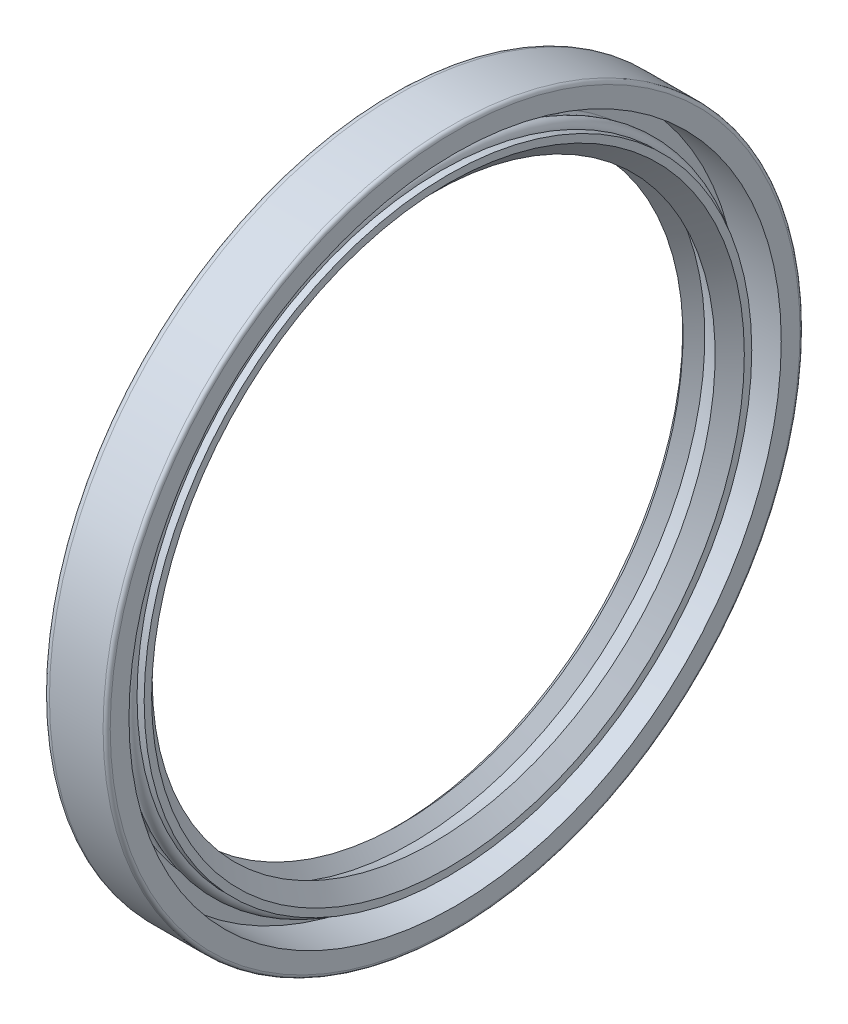
ISO-10303-21;
HEADER;
FILE_DESCRIPTION(('STEP AP214'),'2;1');
FILE_NAME('part.step','',(''),(''),'','','');
FILE_SCHEMA(('AUTOMOTIVE_DESIGN { 1 0 10303 214 1 1 1 1 }'));
ENDSEC;
DATA;
#1=APPLICATION_CONTEXT('core data for automotive mechanical design processes');
#2=APPLICATION_PROTOCOL_DEFINITION('international standard','automotive_design',2000,#1);
#3=PRODUCT_CONTEXT('',#1,'mechanical');
#4=PRODUCT('Part','Part','',(#3));
#5=PRODUCT_RELATED_PRODUCT_CATEGORY('part','',(#4));
#6=PRODUCT_DEFINITION_FORMATION('','',#4);
#7=PRODUCT_DEFINITION_CONTEXT('part definition',#1,'design');
#8=PRODUCT_DEFINITION('design','',#6,#7);
#9=PRODUCT_DEFINITION_SHAPE('','',#8);
#10=(LENGTH_UNIT() NAMED_UNIT(*) SI_UNIT(.MILLI.,.METRE.));
#11=(NAMED_UNIT(*) PLANE_ANGLE_UNIT() SI_UNIT($,.RADIAN.));
#12=(NAMED_UNIT(*) SI_UNIT($,.STERADIAN.) SOLID_ANGLE_UNIT());
#13=UNCERTAINTY_MEASURE_WITH_UNIT(LENGTH_MEASURE(1.E-05),#10,'distance_accuracy_value','');
#14=(GEOMETRIC_REPRESENTATION_CONTEXT(3) GLOBAL_UNCERTAINTY_ASSIGNED_CONTEXT((#13)) GLOBAL_UNIT_ASSIGNED_CONTEXT((#10,
#11,#12)) REPRESENTATION_CONTEXT('',''));
#15=CARTESIAN_POINT('',(0.,0.,0.));
#16=DIRECTION('',(0.,0.,1.));
#17=DIRECTION('',(1.,0.,0.));
#18=AXIS2_PLACEMENT_3D('',#15,#16,#17);
#19=CARTESIAN_POINT('',(0.,-64.3721213387213,-63.666666666667));
#20=DIRECTION('',(-1.,0.,0.));
#21=DIRECTION('',(0.,0.,1.));
#22=AXIS2_PLACEMENT_3D('',#19,#20,#21);
#23=PLANE('',#22);
#24=CARTESIAN_POINT('',(0.,0.,0.));
#25=DIRECTION('',(-1.,0.,0.));
#26=DIRECTION('',(0.,0.,-1.));
#27=AXIS2_PLACEMENT_3D('',#24,#25,#26);
#28=CIRCLE('',#27,63.6666666666671);
#29=CARTESIAN_POINT('',(0.,0.,-63.6666666666671));
#30=VERTEX_POINT('',#29);
#31=EDGE_CURVE('E108',#30,#30,#28,.F.);
#32=ORIENTED_EDGE('',*,*,#31,.F.);
#33=EDGE_LOOP('',(#32));
#34=FACE_BOUND('',#33,.T.);
#35=CARTESIAN_POINT('',(0.,0.,0.));
#36=DIRECTION('',(1.,0.,0.));
#37=DIRECTION('',(0.,0.,1.));
#38=AXIS2_PLACEMENT_3D('',#35,#36,#37);
#39=CIRCLE('',#38,60.833333333333);
#40=CARTESIAN_POINT('',(0.,0.,60.833333333333));
#41=VERTEX_POINT('',#40);
#42=EDGE_CURVE('E104',#41,#41,#39,.T.);
#43=ORIENTED_EDGE('',*,*,#42,.T.);
#44=EDGE_LOOP('',(#43));
#45=FACE_BOUND('',#44,.T.);
#46=ADVANCED_FACE('F15',(#34,#45),#23,.T.);
#47=CARTESIAN_POINT('',(0.2,-61.5073934257409,-60.833333333333));
#48=DIRECTION('',(-1.,0.,0.));
#49=DIRECTION('',(0.,0.,1.));
#50=AXIS2_PLACEMENT_3D('',#47,#48,#49);
#51=PLANE('',#50);
#52=CARTESIAN_POINT('',(0.2,0.,0.));
#53=DIRECTION('',(-1.,0.,0.));
#54=DIRECTION('',(0.,0.,-1.));
#55=AXIS2_PLACEMENT_3D('',#52,#53,#54);
#56=CIRCLE('',#55,60.833333333333);
#57=CARTESIAN_POINT('',(0.2,0.,-60.833333333333));
#58=VERTEX_POINT('',#57);
#59=EDGE_CURVE('E100',#58,#58,#56,.F.);
#60=ORIENTED_EDGE('',*,*,#59,.F.);
#61=EDGE_LOOP('',(#60));
#62=FACE_BOUND('',#61,.T.);
#63=CARTESIAN_POINT('',(0.2,0.,0.));
#64=DIRECTION('',(1.,0.,0.));
#65=DIRECTION('',(0.,0.,1.));
#66=AXIS2_PLACEMENT_3D('',#63,#64,#65);
#67=CIRCLE('',#66,56.666666666667);
#68=CARTESIAN_POINT('',(0.2,0.,56.666666666667));
#69=VERTEX_POINT('',#68);
#70=EDGE_CURVE('E96',#69,#69,#67,.T.);
#71=ORIENTED_EDGE('',*,*,#70,.T.);
#72=EDGE_LOOP('',(#71));
#73=FACE_BOUND('',#72,.T.);
#74=ADVANCED_FACE('F117',(#62,#73),#51,.T.);
#75=CARTESIAN_POINT('',(0.,-57.2945582595949,-56.666666666667));
#76=DIRECTION('',(-1.,0.,0.));
#77=DIRECTION('',(0.,0.,1.));
#78=AXIS2_PLACEMENT_3D('',#75,#76,#77);
#79=PLANE('',#78);
#80=CARTESIAN_POINT('',(0.,0.,0.));
#81=DIRECTION('',(-1.,0.,0.));
#82=DIRECTION('',(0.,0.,-1.));
#83=AXIS2_PLACEMENT_3D('',#80,#81,#82);
#84=CIRCLE('',#83,56.666666666667);
#85=CARTESIAN_POINT('',(0.,0.,-56.666666666667));
#86=VERTEX_POINT('',#85);
#87=EDGE_CURVE('E92',#86,#86,#84,.F.);
#88=ORIENTED_EDGE('',*,*,#87,.F.);
#89=EDGE_LOOP('',(#88));
#90=FACE_BOUND('',#89,.T.);
#91=CARTESIAN_POINT('',(0.,0.,0.));
#92=DIRECTION('',(1.,0.,0.));
#93=DIRECTION('',(0.,0.,1.));
#94=AXIS2_PLACEMENT_3D('',#91,#92,#93);
#95=CIRCLE('',#94,55.625);
#96=CARTESIAN_POINT('',(0.,0.,55.625));
#97=VERTEX_POINT('',#96);
#98=EDGE_CURVE('E88',#97,#97,#95,.T.);
#99=ORIENTED_EDGE('',*,*,#98,.T.);
#100=EDGE_LOOP('',(#99));
#101=FACE_BOUND('',#100,.T.);
#102=ADVANCED_FACE('F308',(#90,#101),#79,.T.);
#103=CARTESIAN_POINT('',(10.6666665,-57.2945582595949,56.666666666667));
#104=DIRECTION('',(1.,0.,0.));
#105=DIRECTION('',(0.,0.,-1.));
#106=AXIS2_PLACEMENT_3D('',#103,#104,#105);
#107=PLANE('',#106);
#108=CARTESIAN_POINT('',(10.6666665,0.,0.));
#109=DIRECTION('',(1.,0.,0.));
#110=DIRECTION('',(0.,0.,1.));
#111=AXIS2_PLACEMENT_3D('',#108,#109,#110);
#112=CIRCLE('',#111,56.666666666667);
#113=CARTESIAN_POINT('',(10.6666665,0.,56.666666666667));
#114=VERTEX_POINT('',#113);
#115=EDGE_CURVE('E84',#114,#114,#112,.T.);
#116=ORIENTED_EDGE('',*,*,#115,.T.);
#117=EDGE_LOOP('',(#116));
#118=FACE_BOUND('',#117,.T.);
#119=CARTESIAN_POINT('',(10.6666665,0.,0.));
#120=DIRECTION('',(-1.,0.,0.));
#121=DIRECTION('',(0.,0.,-1.));
#122=AXIS2_PLACEMENT_3D('',#119,#120,#121);
#123=CIRCLE('',#122,55.277777604167);
#124=CARTESIAN_POINT('',(10.6666665,0.,-55.277777604167));
#125=VERTEX_POINT('',#124);
#126=EDGE_CURVE('E80',#125,#125,#123,.F.);
#127=ORIENTED_EDGE('',*,*,#126,.F.);
#128=EDGE_LOOP('',(#127));
#129=FACE_BOUND('',#128,.T.);
#130=ADVANCED_FACE('F299',(#118,#129),#107,.T.);
#131=CARTESIAN_POINT('',(4.,-61.5073934257409,60.833333333333));
#132=DIRECTION('',(1.,0.,0.));
#133=DIRECTION('',(0.,0.,-1.));
#134=AXIS2_PLACEMENT_3D('',#131,#132,#133);
#135=PLANE('',#134);
#136=CARTESIAN_POINT('',(4.,0.,0.));
#137=DIRECTION('',(1.,0.,0.));
#138=DIRECTION('',(0.,0.,1.));
#139=AXIS2_PLACEMENT_3D('',#136,#137,#138);
#140=CIRCLE('',#139,60.833333333333);
#141=CARTESIAN_POINT('',(4.,0.,60.833333333333));
#142=VERTEX_POINT('',#141);
#143=EDGE_CURVE('E76',#142,#142,#140,.T.);
#144=ORIENTED_EDGE('',*,*,#143,.T.);
#145=EDGE_LOOP('',(#144));
#146=FACE_BOUND('',#145,.T.);
#147=CARTESIAN_POINT('',(4.,0.,0.));
#148=DIRECTION('',(-1.,0.,0.));
#149=DIRECTION('',(0.,0.,-1.));
#150=AXIS2_PLACEMENT_3D('',#147,#148,#149);
#151=CIRCLE('',#150,57.333333166667);
#152=CARTESIAN_POINT('',(4.,0.,-57.333333166667));
#153=VERTEX_POINT('',#152);
#154=EDGE_CURVE('E72',#153,#153,#151,.F.);
#155=ORIENTED_EDGE('',*,*,#154,.F.);
#156=EDGE_LOOP('',(#155));
#157=FACE_BOUND('',#156,.T.);
#158=ADVANCED_FACE('F135',(#146,#157),#135,.T.);
#159=CARTESIAN_POINT('',(12.,-65.0461749653041,64.333333333333));
#160=DIRECTION('',(1.,0.,0.));
#161=DIRECTION('',(0.,0.,-1.));
#162=AXIS2_PLACEMENT_3D('',#159,#160,#161);
#163=PLANE('',#162);
#164=CARTESIAN_POINT('',(12.,0.,0.));
#165=DIRECTION('',(1.,0.,0.));
#166=DIRECTION('',(0.,0.,1.));
#167=AXIS2_PLACEMENT_3D('',#164,#165,#166);
#168=CIRCLE('',#167,64.333333333333);
#169=CARTESIAN_POINT('',(12.,0.,64.333333333333));
#170=VERTEX_POINT('',#169);
#171=EDGE_CURVE('E68',#170,#170,#168,.T.);
#172=ORIENTED_EDGE('',*,*,#171,.T.);
#173=EDGE_LOOP('',(#172));
#174=FACE_BOUND('',#173,.T.);
#175=CARTESIAN_POINT('',(12.,0.,0.));
#176=DIRECTION('',(-1.,0.,0.));
#177=DIRECTION('',(0.,0.,-1.));
#178=AXIS2_PLACEMENT_3D('',#175,#176,#177);
#179=CIRCLE('',#178,60.833333333333);
#180=CARTESIAN_POINT('',(12.,0.,-60.833333333333));
#181=VERTEX_POINT('',#180);
#182=EDGE_CURVE('E64',#181,#181,#179,.F.);
#183=ORIENTED_EDGE('',*,*,#182,.F.);
#184=EDGE_LOOP('',(#183));
#185=FACE_BOUND('',#184,.T.);
#186=ADVANCED_FACE('F124',(#174,#185),#163,.T.);
#187=CARTESIAN_POINT('',(12.,0.,0.));
#188=DIRECTION('',(1.,0.,0.));
#189=DIRECTION('',(0.,0.,1.));
#190=AXIS2_PLACEMENT_3D('',#187,#188,#189);
#191=CYLINDRICAL_SURFACE('',#190,60.833333333333);
#192=ORIENTED_EDGE('',*,*,#59,.T.);
#193=EDGE_LOOP('',(#192));
#194=FACE_BOUND('',#193,.T.);
#195=ORIENTED_EDGE('',*,*,#42,.F.);
#196=EDGE_LOOP('',(#195));
#197=FACE_BOUND('',#196,.T.);
#198=ADVANCED_FACE('F121',(#194,#197),#191,.F.);
#199=CARTESIAN_POINT('',(12.,0.,0.));
#200=DIRECTION('',(1.,0.,0.));
#201=DIRECTION('',(0.,0.,1.));
#202=AXIS2_PLACEMENT_3D('',#199,#200,#201);
#203=CYLINDRICAL_SURFACE('',#202,56.666666666667);
#204=ORIENTED_EDGE('',*,*,#87,.T.);
#205=EDGE_LOOP('',(#204));
#206=FACE_BOUND('',#205,.T.);
#207=ORIENTED_EDGE('',*,*,#70,.F.);
#208=EDGE_LOOP('',(#207));
#209=FACE_BOUND('',#208,.T.);
#210=ADVANCED_FACE('F123',(#206,#209),#203,.T.);
#211=CARTESIAN_POINT('',(0.,0.,0.));
#212=DIRECTION('',(-1.,0.,0.));
#213=DIRECTION('',(0.,0.,-1.));
#214=AXIS2_PLACEMENT_3D('',#211,#212,#213);
#215=CONICAL_SURFACE('',#214,55.625,0.480175029603656);
#216=ORIENTED_EDGE('',*,*,#98,.F.);
#217=EDGE_LOOP('',(#216));
#218=FACE_BOUND('',#217,.T.);
#219=CARTESIAN_POINT('',(1.99999999999998,0.,0.));
#220=DIRECTION('',(1.,0.,0.));
#221=DIRECTION('',(0.,0.,1.));
#222=AXIS2_PLACEMENT_3D('',#219,#220,#221);
#223=CIRCLE('',#222,54.583333333333);
#224=CARTESIAN_POINT('',(1.99999999999998,0.,54.583333333333));
#225=VERTEX_POINT('',#224);
#226=EDGE_CURVE('E60',#225,#225,#223,.T.);
#227=ORIENTED_EDGE('',*,*,#226,.T.);
#228=EDGE_LOOP('',(#227));
#229=FACE_BOUND('',#228,.T.);
#230=ADVANCED_FACE('F132',(#218,#229),#215,.F.);
#231=CARTESIAN_POINT('',(2.,0.,0.));
#232=DIRECTION('',(1.,0.,0.));
#233=DIRECTION('',(0.,0.,1.));
#234=AXIS2_PLACEMENT_3D('',#231,#232,#233);
#235=CONICAL_SURFACE('',#234,54.583333333333,0.805803494083782);
#236=CARTESIAN_POINT('',(0.959200666111578,0.,0.));
#237=DIRECTION('',(1.,0.,0.));
#238=DIRECTION('',(0.,0.,1.));
#239=AXIS2_PLACEMENT_3D('',#236,#237,#238);
#240=CIRCLE('',#239,53.499167360533);
#241=CARTESIAN_POINT('',(0.959200666111578,0.,53.499167360533));
#242=VERTEX_POINT('',#241);
#243=EDGE_CURVE('E56',#242,#242,#240,.T.);
#244=ORIENTED_EDGE('',*,*,#243,.T.);
#245=EDGE_LOOP('',(#244));
#246=FACE_BOUND('',#245,.T.);
#247=ORIENTED_EDGE('',*,*,#226,.F.);
#248=EDGE_LOOP('',(#247));
#249=FACE_BOUND('',#248,.T.);
#250=ADVANCED_FACE('F142',(#246,#249),#235,.T.);
#251=CARTESIAN_POINT('',(0.959200666111562,0.,0.));
#252=DIRECTION('',(-1.,0.,0.));
#253=DIRECTION('',(0.,0.,-1.));
#254=AXIS2_PLACEMENT_3D('',#251,#252,#253);
#255=CONICAL_SURFACE('',#254,53.499167360533,0.764992832710965);
#256=ORIENTED_EDGE('',*,*,#243,.F.);
#257=EDGE_LOOP('',(#256));
#258=FACE_BOUND('',#257,.T.);
#259=CARTESIAN_POINT('',(2.,0.,0.));
#260=DIRECTION('',(1.,0.,0.));
#261=DIRECTION('',(0.,0.,1.));
#262=AXIS2_PLACEMENT_3D('',#259,#260,#261);
#263=CIRCLE('',#262,52.5);
#264=CARTESIAN_POINT('',(2.,0.,52.5));
#265=VERTEX_POINT('',#264);
#266=EDGE_CURVE('E52',#265,#265,#263,.T.);
#267=ORIENTED_EDGE('',*,*,#266,.T.);
#268=EDGE_LOOP('',(#267));
#269=FACE_BOUND('',#268,.T.);
#270=ADVANCED_FACE('F146',(#258,#269),#255,.F.);
#271=CARTESIAN_POINT('',(4.,0.,0.));
#272=DIRECTION('',(1.,0.,0.));
#273=DIRECTION('',(0.,0.,1.));
#274=AXIS2_PLACEMENT_3D('',#271,#272,#273);
#275=CONICAL_SURFACE('',#274,54.583333333333,0.805803494083906);
#276=CARTESIAN_POINT('',(4.,0.,0.));
#277=DIRECTION('',(1.,0.,0.));
#278=DIRECTION('',(0.,0.,1.));
#279=AXIS2_PLACEMENT_3D('',#276,#277,#278);
#280=CIRCLE('',#279,54.583333333333);
#281=CARTESIAN_POINT('',(4.,0.,54.583333333333));
#282=VERTEX_POINT('',#281);
#283=EDGE_CURVE('E48',#282,#282,#280,.T.);
#284=ORIENTED_EDGE('',*,*,#283,.T.);
#285=EDGE_LOOP('',(#284));
#286=FACE_BOUND('',#285,.T.);
#287=ORIENTED_EDGE('',*,*,#266,.F.);
#288=EDGE_LOOP('',(#287));
#289=FACE_BOUND('',#288,.T.);
#290=ADVANCED_FACE('F150',(#286,#289),#275,.F.);
#291=CARTESIAN_POINT('',(3.99999999999999,0.,0.));
#292=DIRECTION('',(-1.,0.,0.));
#293=DIRECTION('',(0.,0.,-1.));
#294=AXIS2_PLACEMENT_3D('',#291,#292,#293);
#295=CONICAL_SURFACE('',#294,54.583333333333,0.480175029603461);
#296=ORIENTED_EDGE('',*,*,#283,.F.);
#297=EDGE_LOOP('',(#296));
#298=FACE_BOUND('',#297,.T.);
#299=CARTESIAN_POINT('',(8.,0.,0.));
#300=DIRECTION('',(1.,0.,0.));
#301=DIRECTION('',(0.,0.,1.));
#302=AXIS2_PLACEMENT_3D('',#299,#300,#301);
#303=CIRCLE('',#302,52.5);
#304=CARTESIAN_POINT('',(8.,0.,52.5));
#305=VERTEX_POINT('',#304);
#306=EDGE_CURVE('E44',#305,#305,#303,.T.);
#307=ORIENTED_EDGE('',*,*,#306,.T.);
#308=EDGE_LOOP('',(#307));
#309=FACE_BOUND('',#308,.T.);
#310=ADVANCED_FACE('F154',(#298,#309),#295,.F.);
#311=CARTESIAN_POINT('',(10.6666665,0.,0.));
#312=DIRECTION('',(1.,0.,0.));
#313=DIRECTION('',(0.,0.,1.));
#314=AXIS2_PLACEMENT_3D('',#311,#312,#313);
#315=CONICAL_SURFACE('',#314,55.277777604167,0.805803494084047);
#316=ORIENTED_EDGE('',*,*,#126,.T.);
#317=EDGE_LOOP('',(#316));
#318=FACE_BOUND('',#317,.T.);
#319=ORIENTED_EDGE('',*,*,#306,.F.);
#320=EDGE_LOOP('',(#319));
#321=FACE_BOUND('',#320,.T.);
#322=ADVANCED_FACE('F158',(#318,#321),#315,.F.);
#323=CARTESIAN_POINT('',(12.,0.,0.));
#324=DIRECTION('',(1.,0.,0.));
#325=DIRECTION('',(0.,0.,1.));
#326=AXIS2_PLACEMENT_3D('',#323,#324,#325);
#327=CYLINDRICAL_SURFACE('',#326,56.666666666667);
#328=CARTESIAN_POINT('',(9.333333,0.,0.));
#329=DIRECTION('',(1.,0.,0.));
#330=DIRECTION('',(0.,0.,1.));
#331=AXIS2_PLACEMENT_3D('',#328,#329,#330);
#332=CIRCLE('',#331,56.666666666667);
#333=CARTESIAN_POINT('',(9.333333,0.,56.666666666667));
#334=VERTEX_POINT('',#333);
#335=EDGE_CURVE('E40',#334,#334,#332,.T.);
#336=ORIENTED_EDGE('',*,*,#335,.T.);
#337=EDGE_LOOP('',(#336));
#338=FACE_BOUND('',#337,.T.);
#339=ORIENTED_EDGE('',*,*,#115,.F.);
#340=EDGE_LOOP('',(#339));
#341=FACE_BOUND('',#340,.T.);
#342=ADVANCED_FACE('F162',(#338,#341),#327,.T.);
#343=CARTESIAN_POINT('',(8.,0.,0.));
#344=DIRECTION('',(1.,0.,0.));
#345=DIRECTION('',(0.,0.,1.));
#346=AXIS2_PLACEMENT_3D('',#343,#344,#345);
#347=TOROIDAL_SURFACE('',#346,56.666666666667,1.333333);
#348=CARTESIAN_POINT('',(6.666667,0.,0.));
#349=DIRECTION('',(1.,0.,0.));
#350=DIRECTION('',(0.,0.,1.));
#351=AXIS2_PLACEMENT_3D('',#348,#349,#350);
#352=CIRCLE('',#351,56.666666666667);
#353=CARTESIAN_POINT('',(6.666667,0.,56.666666666667));
#354=VERTEX_POINT('',#353);
#355=EDGE_CURVE('E34',#354,#354,#352,.T.);
#356=ORIENTED_EDGE('',*,*,#355,.T.);
#357=EDGE_LOOP('',(#356));
#358=FACE_BOUND('',#357,.T.);
#359=ORIENTED_EDGE('',*,*,#335,.F.);
#360=EDGE_LOOP('',(#359));
#361=FACE_BOUND('',#360,.T.);
#362=ADVANCED_FACE('F166',(#358,#361),#347,.T.);
#363=CARTESIAN_POINT('',(12.,0.,0.));
#364=DIRECTION('',(1.,0.,0.));
#365=DIRECTION('',(0.,0.,1.));
#366=AXIS2_PLACEMENT_3D('',#363,#364,#365);
#367=CYLINDRICAL_SURFACE('',#366,56.666666666667);
#368=CARTESIAN_POINT('',(4.6666665,0.,0.));
#369=DIRECTION('',(1.,0.,0.));
#370=DIRECTION('',(0.,0.,1.));
#371=AXIS2_PLACEMENT_3D('',#368,#369,#370);
#372=CIRCLE('',#371,56.666666666667);
#373=CARTESIAN_POINT('',(4.6666665,0.,56.666666666667));
#374=VERTEX_POINT('',#373);
#375=EDGE_CURVE('E29',#374,#374,#372,.T.);
#376=ORIENTED_EDGE('',*,*,#375,.T.);
#377=EDGE_LOOP('',(#376));
#378=FACE_BOUND('',#377,.T.);
#379=ORIENTED_EDGE('',*,*,#355,.F.);
#380=EDGE_LOOP('',(#379));
#381=FACE_BOUND('',#380,.T.);
#382=ADVANCED_FACE('F170',(#378,#381),#367,.T.);
#383=CARTESIAN_POINT('',(4.66666649999984,0.,0.));
#384=DIRECTION('',(1.,0.,0.));
#385=DIRECTION('',(0.,7.69333164181571E-10,1.));
#386=AXIS2_PLACEMENT_3D('',#383,#384,#385);
#387=TOROIDAL_SURFACE('',#386,57.3333331666668,0.666666499999837);
#388=ORIENTED_EDGE('',*,*,#154,.T.);
#389=EDGE_LOOP('',(#388));
#390=FACE_BOUND('',#389,.T.);
#391=ORIENTED_EDGE('',*,*,#375,.F.);
#392=EDGE_LOOP('',(#391));
#393=FACE_BOUND('',#392,.T.);
#394=ADVANCED_FACE('F174',(#390,#393),#387,.F.);
#395=CARTESIAN_POINT('',(12.,0.,0.));
#396=DIRECTION('',(1.,0.,0.));
#397=DIRECTION('',(0.,0.,1.));
#398=AXIS2_PLACEMENT_3D('',#395,#396,#397);
#399=CYLINDRICAL_SURFACE('',#398,60.833333333333);
#400=ORIENTED_EDGE('',*,*,#182,.T.);
#401=EDGE_LOOP('',(#400));
#402=FACE_BOUND('',#401,.T.);
#403=ORIENTED_EDGE('',*,*,#143,.F.);
#404=EDGE_LOOP('',(#403));
#405=FACE_BOUND('',#404,.T.);
#406=ADVANCED_FACE('F178',(#402,#405),#399,.F.);
#407=CARTESIAN_POINT('',(11.3333333333321,0.,0.));
#408=DIRECTION('',(1.,0.,0.));
#409=DIRECTION('',(0.,0.,1.));
#410=AXIS2_PLACEMENT_3D('',#407,#408,#409);
#411=TOROIDAL_SURFACE('',#410,64.3333333333321,0.666666666667927);
#412=CARTESIAN_POINT('',(11.3333333333321,0.,0.));
#413=DIRECTION('',(1.,0.,0.));
#414=DIRECTION('',(0.,0.,1.));
#415=AXIS2_PLACEMENT_3D('',#412,#413,#414);
#416=CIRCLE('',#415,65.);
#417=CARTESIAN_POINT('',(11.3333333333321,0.,65.));
#418=VERTEX_POINT('',#417);
#419=EDGE_CURVE('E23',#418,#418,#416,.T.);
#420=ORIENTED_EDGE('',*,*,#419,.T.);
#421=EDGE_LOOP('',(#420));
#422=FACE_BOUND('',#421,.T.);
#423=ORIENTED_EDGE('',*,*,#171,.F.);
#424=EDGE_LOOP('',(#423));
#425=FACE_BOUND('',#424,.T.);
#426=ADVANCED_FACE('F182',(#422,#425),#411,.T.);
#427=CARTESIAN_POINT('',(12.,0.,0.));
#428=DIRECTION('',(1.,0.,0.));
#429=DIRECTION('',(0.,0.,1.));
#430=AXIS2_PLACEMENT_3D('',#427,#428,#429);
#431=CYLINDRICAL_SURFACE('',#430,65.);
#432=CARTESIAN_POINT('',(1.3333333333333,0.,0.));
#433=DIRECTION('',(1.,0.,0.));
#434=DIRECTION('',(0.,0.,1.));
#435=AXIS2_PLACEMENT_3D('',#432,#433,#434);
#436=CIRCLE('',#435,65.);
#437=CARTESIAN_POINT('',(1.3333333333333,0.,65.));
#438=VERTEX_POINT('',#437);
#439=EDGE_CURVE('E10',#438,#438,#436,.T.);
#440=ORIENTED_EDGE('',*,*,#439,.T.);
#441=EDGE_LOOP('',(#440));
#442=FACE_BOUND('',#441,.T.);
#443=ORIENTED_EDGE('',*,*,#419,.F.);
#444=EDGE_LOOP('',(#443));
#445=FACE_BOUND('',#444,.T.);
#446=ADVANCED_FACE('F185',(#442,#445),#431,.T.);
#447=CARTESIAN_POINT('',(1.33333333333287,0.,0.));
#448=DIRECTION('',(1.,0.,0.));
#449=DIRECTION('',(0.,0.,1.));
#450=AXIS2_PLACEMENT_3D('',#447,#448,#449);
#451=TOROIDAL_SURFACE('',#450,63.6666666666671,1.33333333333287);
#452=ORIENTED_EDGE('',*,*,#31,.T.);
#453=EDGE_LOOP('',(#452));
#454=FACE_BOUND('',#453,.T.);
#455=ORIENTED_EDGE('',*,*,#439,.F.);
#456=EDGE_LOOP('',(#455));
#457=FACE_BOUND('',#456,.T.);
#458=ADVANCED_FACE('F17',(#454,#457),#451,.T.);
#459=CLOSED_SHELL('',(#46,#74,#102,#130,#158,#186,#198,#210,#230,#250,#270,#290,#310,#322,#342,
#362,#382,#394,#406,#426,#446,#458));
#460=MANIFOLD_SOLID_BREP('B1',#459);
#461=ADVANCED_BREP_SHAPE_REPRESENTATION('',(#18,#460),#14);
#462=SHAPE_DEFINITION_REPRESENTATION(#9,#461);
ENDSEC;
END-ISO-10303-21;
